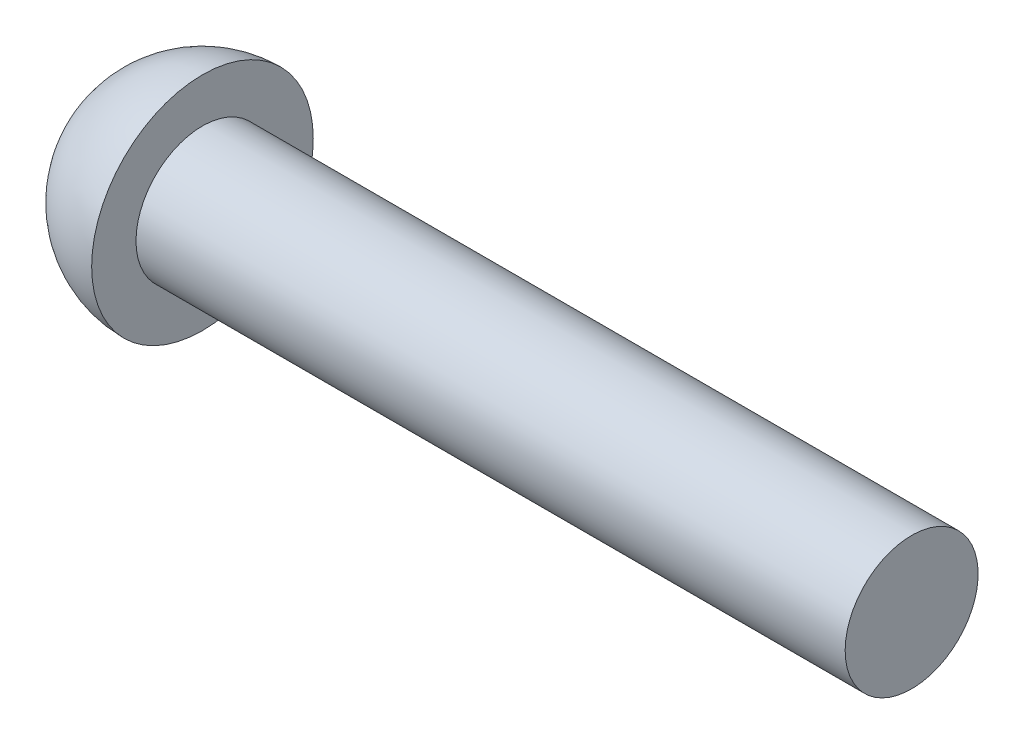
ISO-10303-21;
HEADER;
FILE_DESCRIPTION(('STEP AP214'),'2;1');
FILE_NAME('part.step','',(''),(''),'','','');
FILE_SCHEMA(('AUTOMOTIVE_DESIGN { 1 0 10303 214 1 1 1 1 }'));
ENDSEC;
DATA;
#1=APPLICATION_CONTEXT('core data for automotive mechanical design processes');
#2=APPLICATION_PROTOCOL_DEFINITION('international standard','automotive_design',2000,#1);
#3=PRODUCT_CONTEXT('',#1,'mechanical');
#4=PRODUCT('Part','Part','',(#3));
#5=PRODUCT_RELATED_PRODUCT_CATEGORY('part','',(#4));
#6=PRODUCT_DEFINITION_FORMATION('','',#4);
#7=PRODUCT_DEFINITION_CONTEXT('part definition',#1,'design');
#8=PRODUCT_DEFINITION('design','',#6,#7);
#9=PRODUCT_DEFINITION_SHAPE('','',#8);
#10=(LENGTH_UNIT() NAMED_UNIT(*) SI_UNIT(.MILLI.,.METRE.));
#11=(NAMED_UNIT(*) PLANE_ANGLE_UNIT() SI_UNIT($,.RADIAN.));
#12=(NAMED_UNIT(*) SI_UNIT($,.STERADIAN.) SOLID_ANGLE_UNIT());
#13=UNCERTAINTY_MEASURE_WITH_UNIT(LENGTH_MEASURE(1.E-05),#10,'distance_accuracy_value','');
#14=(GEOMETRIC_REPRESENTATION_CONTEXT(3) GLOBAL_UNCERTAINTY_ASSIGNED_CONTEXT((#13)) GLOBAL_UNIT_ASSIGNED_CONTEXT((#10,
#11,#12)) REPRESENTATION_CONTEXT('',''));
#15=CARTESIAN_POINT('',(0.,0.,0.));
#16=DIRECTION('',(0.,0.,1.));
#17=DIRECTION('',(1.,0.,0.));
#18=AXIS2_PLACEMENT_3D('',#15,#16,#17);
#19=CARTESIAN_POINT('',(0.,1.5,0.));
#20=DIRECTION('',(-1.,0.,0.));
#21=DIRECTION('',(0.,0.,1.));
#22=AXIS2_PLACEMENT_3D('',#19,#20,#21);
#23=PLANE('',#22);
#24=CARTESIAN_POINT('',(0.,0.,0.));
#25=DIRECTION('',(-1.,0.,0.));
#26=DIRECTION('',(0.,0.,1.));
#27=AXIS2_PLACEMENT_3D('',#24,#25,#26);
#28=CIRCLE('',#27,2.5);
#29=CARTESIAN_POINT('',(0.,0.,2.5));
#30=VERTEX_POINT('',#29);
#31=EDGE_CURVE('E10',#30,#30,#28,.T.);
#32=ORIENTED_EDGE('',*,*,#31,.F.);
#33=EDGE_LOOP('',(#32));
#34=FACE_BOUND('',#33,.T.);
#35=CARTESIAN_POINT('',(0.,0.,0.));
#36=DIRECTION('',(-1.,0.,0.));
#37=DIRECTION('',(0.,0.,1.));
#38=AXIS2_PLACEMENT_3D('',#35,#36,#37);
#39=CIRCLE('',#38,1.5);
#40=CARTESIAN_POINT('',(0.,0.,1.5));
#41=VERTEX_POINT('',#40);
#42=EDGE_CURVE('E41',#41,#41,#39,.T.);
#43=ORIENTED_EDGE('',*,*,#42,.T.);
#44=EDGE_LOOP('',(#43));
#45=FACE_BOUND('',#44,.T.);
#46=ADVANCED_FACE('F31',(#34,#45),#23,.F.);
#47=CARTESIAN_POINT('',(0.,0.,0.));
#48=DIRECTION('',(-1.,0.,0.));
#49=DIRECTION('',(0.,1.,0.));
#50=AXIS2_PLACEMENT_3D('',#47,#48,#49);
#51=SPHERICAL_SURFACE('',#50,2.5);
#52=ORIENTED_EDGE('',*,*,#31,.T.);
#53=EDGE_LOOP('',(#52));
#54=FACE_BOUND('',#53,.T.);
#55=ADVANCED_FACE('F56',(#54),#51,.T.);
#56=CARTESIAN_POINT('',(16.,1.5,0.));
#57=DIRECTION('',(-1.,0.,0.));
#58=DIRECTION('',(0.,0.,1.));
#59=AXIS2_PLACEMENT_3D('',#56,#57,#58);
#60=PLANE('',#59);
#61=CARTESIAN_POINT('',(16.,0.,0.));
#62=DIRECTION('',(-1.,0.,0.));
#63=DIRECTION('',(0.,0.,1.));
#64=AXIS2_PLACEMENT_3D('',#61,#62,#63);
#65=CIRCLE('',#64,1.5);
#66=CARTESIAN_POINT('',(16.,0.,1.5));
#67=VERTEX_POINT('',#66);
#68=EDGE_CURVE('E37',#67,#67,#65,.T.);
#69=ORIENTED_EDGE('',*,*,#68,.F.);
#70=EDGE_LOOP('',(#69));
#71=FACE_BOUND('',#70,.T.);
#72=ADVANCED_FACE('F51',(#71),#60,.F.);
#73=CARTESIAN_POINT('',(-11.9014090187677,0.,0.));
#74=DIRECTION('',(-1.,0.,0.));
#75=DIRECTION('',(0.,0.,1.));
#76=AXIS2_PLACEMENT_3D('',#73,#74,#75);
#77=CYLINDRICAL_SURFACE('',#76,1.5);
#78=ORIENTED_EDGE('',*,*,#42,.F.);
#79=EDGE_LOOP('',(#78));
#80=FACE_BOUND('',#79,.T.);
#81=ORIENTED_EDGE('',*,*,#68,.T.);
#82=EDGE_LOOP('',(#81));
#83=FACE_BOUND('',#82,.T.);
#84=ADVANCED_FACE('F49',(#80,#83),#77,.T.);
#85=CLOSED_SHELL('',(#46,#55,#72,#84));
#86=MANIFOLD_SOLID_BREP('B2',#85);
#87=ADVANCED_BREP_SHAPE_REPRESENTATION('',(#18,#86),#14);
#88=SHAPE_DEFINITION_REPRESENTATION(#9,#87);
ENDSEC;
END-ISO-10303-21;
